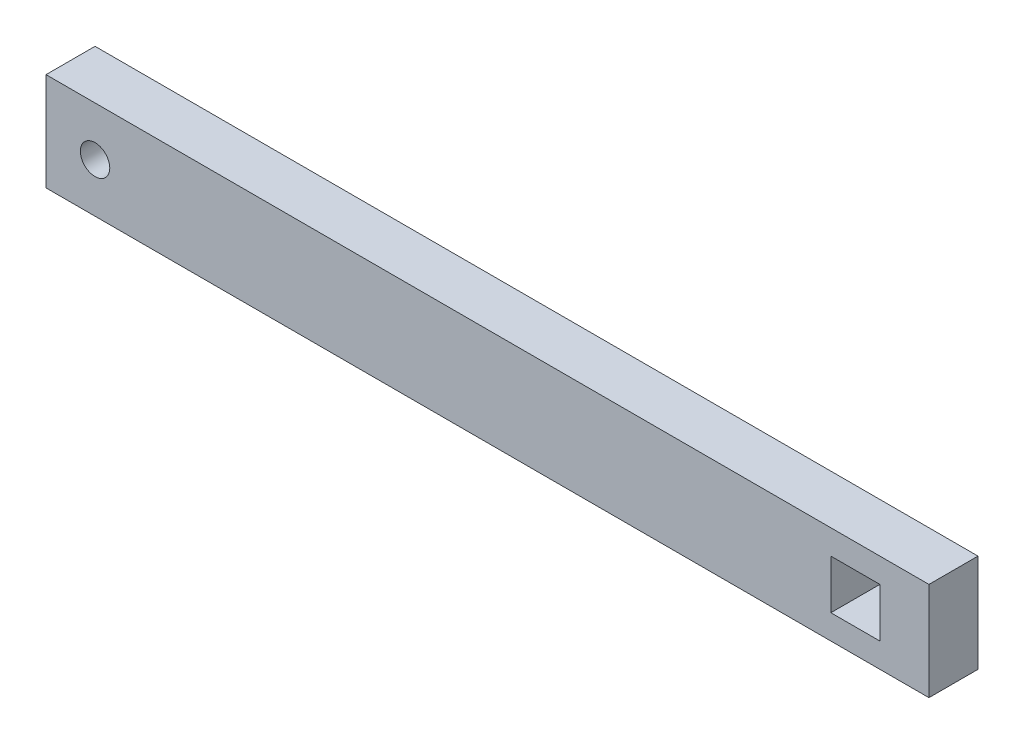
ISO-10303-21;
HEADER;
FILE_DESCRIPTION(('STEP AP214'),'2;1');
FILE_NAME('part.step','',(''),(''),'','','');
FILE_SCHEMA(('AUTOMOTIVE_DESIGN { 1 0 10303 214 1 1 1 1 }'));
ENDSEC;
DATA;
#1=APPLICATION_CONTEXT('core data for automotive mechanical design processes');
#2=APPLICATION_PROTOCOL_DEFINITION('international standard','automotive_design',2000,#1);
#3=PRODUCT_CONTEXT('',#1,'mechanical');
#4=PRODUCT('Part','Part','',(#3));
#5=PRODUCT_RELATED_PRODUCT_CATEGORY('part','',(#4));
#6=PRODUCT_DEFINITION_FORMATION('','',#4);
#7=PRODUCT_DEFINITION_CONTEXT('part definition',#1,'design');
#8=PRODUCT_DEFINITION('design','',#6,#7);
#9=PRODUCT_DEFINITION_SHAPE('','',#8);
#10=(LENGTH_UNIT() NAMED_UNIT(*) SI_UNIT(.MILLI.,.METRE.));
#11=(NAMED_UNIT(*) PLANE_ANGLE_UNIT() SI_UNIT($,.RADIAN.));
#12=(NAMED_UNIT(*) SI_UNIT($,.STERADIAN.) SOLID_ANGLE_UNIT());
#13=UNCERTAINTY_MEASURE_WITH_UNIT(LENGTH_MEASURE(1.E-05),#10,'distance_accuracy_value','');
#14=(GEOMETRIC_REPRESENTATION_CONTEXT(3) GLOBAL_UNCERTAINTY_ASSIGNED_CONTEXT((#13)) GLOBAL_UNIT_ASSIGNED_CONTEXT((#10,
#11,#12)) REPRESENTATION_CONTEXT('',''));
#15=CARTESIAN_POINT('',(0.,0.,0.));
#16=DIRECTION('',(0.,0.,1.));
#17=DIRECTION('',(1.,0.,0.));
#18=AXIS2_PLACEMENT_3D('',#15,#16,#17);
#19=CARTESIAN_POINT('',(0.,0.,5.));
#20=DIRECTION('',(0.,0.,-1.));
#21=DIRECTION('',(-1.,0.,0.));
#22=AXIS2_PLACEMENT_3D('',#19,#20,#21);
#23=PLANE('',#22);
#24=CARTESIAN_POINT('',(5.,5.,5.));
#25=DIRECTION('',(0.,0.,1.));
#26=DIRECTION('',(1.,0.,0.));
#27=AXIS2_PLACEMENT_3D('',#24,#25,#26);
#28=CIRCLE('',#27,1.5);
#29=CARTESIAN_POINT('',(6.5,5.,5.));
#30=VERTEX_POINT('',#29);
#31=EDGE_CURVE('E134',#30,#30,#28,.T.);
#32=ORIENTED_EDGE('',*,*,#31,.F.);
#33=EDGE_LOOP('',(#32));
#34=FACE_BOUND('',#33,.T.);
#35=DIRECTION('',(0.,-1.,0.));
#36=VECTOR('',#35,1.);
#37=CARTESIAN_POINT('',(0.,0.,5.));
#38=LINE('',#37,#36);
#39=CARTESIAN_POINT('',(0.,10.,5.));
#40=VERTEX_POINT('',#39);
#41=CARTESIAN_POINT('',(0.,0.,5.));
#42=VERTEX_POINT('',#41);
#43=EDGE_CURVE('E140',#40,#42,#38,.T.);
#44=ORIENTED_EDGE('',*,*,#43,.T.);
#45=DIRECTION('',(1.,0.,0.));
#46=VECTOR('',#45,1.);
#47=CARTESIAN_POINT('',(0.,0.,5.));
#48=LINE('',#47,#46);
#49=CARTESIAN_POINT('',(90.,0.,5.));
#50=VERTEX_POINT('',#49);
#51=EDGE_CURVE('E143',#42,#50,#48,.T.);
#52=ORIENTED_EDGE('',*,*,#51,.T.);
#53=DIRECTION('',(0.,1.,0.));
#54=VECTOR('',#53,1.);
#55=CARTESIAN_POINT('',(90.,0.,5.));
#56=LINE('',#55,#54);
#57=CARTESIAN_POINT('',(90.,10.,5.));
#58=VERTEX_POINT('',#57);
#59=EDGE_CURVE('E146',#50,#58,#56,.T.);
#60=ORIENTED_EDGE('',*,*,#59,.T.);
#61=DIRECTION('',(-1.,0.,0.));
#62=VECTOR('',#61,1.);
#63=CARTESIAN_POINT('',(0.,10.,5.));
#64=LINE('',#63,#62);
#65=EDGE_CURVE('E148',#58,#40,#64,.T.);
#66=ORIENTED_EDGE('',*,*,#65,.T.);
#67=EDGE_LOOP('',(#44,#52,#60,#66));
#68=FACE_BOUND('',#67,.T.);
#69=DIRECTION('',(0.,1.,0.));
#70=VECTOR('',#69,1.);
#71=CARTESIAN_POINT('',(85.,7.5,5.));
#72=LINE('',#71,#70);
#73=CARTESIAN_POINT('',(85.,2.5,5.));
#74=VERTEX_POINT('',#73);
#75=CARTESIAN_POINT('',(85.,7.5,5.));
#76=VERTEX_POINT('',#75);
#77=EDGE_CURVE('E98',#74,#76,#72,.T.);
#78=ORIENTED_EDGE('',*,*,#77,.F.);
#79=DIRECTION('',(1.,0.,0.));
#80=VECTOR('',#79,1.);
#81=CARTESIAN_POINT('',(85.,2.5,5.));
#82=LINE('',#81,#80);
#83=CARTESIAN_POINT('',(80.,2.5,5.));
#84=VERTEX_POINT('',#83);
#85=EDGE_CURVE('E120',#84,#74,#82,.T.);
#86=ORIENTED_EDGE('',*,*,#85,.F.);
#87=DIRECTION('',(0.,-1.,0.));
#88=VECTOR('',#87,1.);
#89=CARTESIAN_POINT('',(80.,7.5,5.));
#90=LINE('',#89,#88);
#91=CARTESIAN_POINT('',(80.,7.5,5.));
#92=VERTEX_POINT('',#91);
#93=EDGE_CURVE('E118',#92,#84,#90,.T.);
#94=ORIENTED_EDGE('',*,*,#93,.F.);
#95=DIRECTION('',(-1.,0.,0.));
#96=VECTOR('',#95,1.);
#97=CARTESIAN_POINT('',(85.,7.5,5.));
#98=LINE('',#97,#96);
#99=EDGE_CURVE('E106',#76,#92,#98,.T.);
#100=ORIENTED_EDGE('',*,*,#99,.F.);
#101=EDGE_LOOP('',(#78,#86,#94,#100));
#102=FACE_BOUND('',#101,.T.);
#103=ADVANCED_FACE('F33',(#34,#68,#102),#23,.F.);
#104=CARTESIAN_POINT('',(0.,0.,0.));
#105=DIRECTION('',(0.,0.,-1.));
#106=DIRECTION('',(-1.,0.,0.));
#107=AXIS2_PLACEMENT_3D('',#104,#105,#106);
#108=PLANE('',#107);
#109=CARTESIAN_POINT('',(5.,5.,0.));
#110=DIRECTION('',(0.,0.,1.));
#111=DIRECTION('',(1.,0.,0.));
#112=AXIS2_PLACEMENT_3D('',#109,#110,#111);
#113=CIRCLE('',#112,1.5);
#114=CARTESIAN_POINT('',(6.5,5.,0.));
#115=VERTEX_POINT('',#114);
#116=EDGE_CURVE('E114',#115,#115,#113,.T.);
#117=ORIENTED_EDGE('',*,*,#116,.T.);
#118=EDGE_LOOP('',(#117));
#119=FACE_BOUND('',#118,.T.);
#120=DIRECTION('',(0.,-1.,0.));
#121=VECTOR('',#120,1.);
#122=CARTESIAN_POINT('',(0.,0.,0.));
#123=LINE('',#122,#121);
#124=CARTESIAN_POINT('',(0.,10.,0.));
#125=VERTEX_POINT('',#124);
#126=CARTESIAN_POINT('',(0.,0.,0.));
#127=VERTEX_POINT('',#126);
#128=EDGE_CURVE('E137',#125,#127,#123,.T.);
#129=ORIENTED_EDGE('',*,*,#128,.F.);
#130=DIRECTION('',(-1.,0.,0.));
#131=VECTOR('',#130,1.);
#132=CARTESIAN_POINT('',(0.,10.,0.));
#133=LINE('',#132,#131);
#134=CARTESIAN_POINT('',(90.,10.,0.));
#135=VERTEX_POINT('',#134);
#136=EDGE_CURVE('E144',#135,#125,#133,.T.);
#137=ORIENTED_EDGE('',*,*,#136,.F.);
#138=DIRECTION('',(0.,1.,0.));
#139=VECTOR('',#138,1.);
#140=CARTESIAN_POINT('',(90.,0.,0.));
#141=LINE('',#140,#139);
#142=CARTESIAN_POINT('',(90.,0.,0.));
#143=VERTEX_POINT('',#142);
#144=EDGE_CURVE('E155',#143,#135,#141,.T.);
#145=ORIENTED_EDGE('',*,*,#144,.F.);
#146=DIRECTION('',(1.,0.,0.));
#147=VECTOR('',#146,1.);
#148=CARTESIAN_POINT('',(0.,0.,0.));
#149=LINE('',#148,#147);
#150=EDGE_CURVE('E153',#127,#143,#149,.T.);
#151=ORIENTED_EDGE('',*,*,#150,.F.);
#152=EDGE_LOOP('',(#129,#137,#145,#151));
#153=FACE_BOUND('',#152,.T.);
#154=DIRECTION('',(1.,0.,0.));
#155=VECTOR('',#154,1.);
#156=CARTESIAN_POINT('',(85.,2.5,0.));
#157=LINE('',#156,#155);
#158=CARTESIAN_POINT('',(80.,2.5,0.));
#159=VERTEX_POINT('',#158);
#160=CARTESIAN_POINT('',(85.,2.5,0.));
#161=VERTEX_POINT('',#160);
#162=EDGE_CURVE('E107',#159,#161,#157,.T.);
#163=ORIENTED_EDGE('',*,*,#162,.T.);
#164=DIRECTION('',(0.,1.,0.));
#165=VECTOR('',#164,1.);
#166=CARTESIAN_POINT('',(85.,7.5,0.));
#167=LINE('',#166,#165);
#168=CARTESIAN_POINT('',(85.,7.5,0.));
#169=VERTEX_POINT('',#168);
#170=EDGE_CURVE('E56',#161,#169,#167,.T.);
#171=ORIENTED_EDGE('',*,*,#170,.T.);
#172=DIRECTION('',(-1.,0.,0.));
#173=VECTOR('',#172,1.);
#174=CARTESIAN_POINT('',(85.,7.5,0.));
#175=LINE('',#174,#173);
#176=CARTESIAN_POINT('',(80.,7.5,0.));
#177=VERTEX_POINT('',#176);
#178=EDGE_CURVE('E113',#169,#177,#175,.T.);
#179=ORIENTED_EDGE('',*,*,#178,.T.);
#180=DIRECTION('',(0.,-1.,0.));
#181=VECTOR('',#180,1.);
#182=CARTESIAN_POINT('',(80.,7.5,0.));
#183=LINE('',#182,#181);
#184=EDGE_CURVE('E126',#177,#159,#183,.T.);
#185=ORIENTED_EDGE('',*,*,#184,.T.);
#186=EDGE_LOOP('',(#163,#171,#179,#185));
#187=FACE_BOUND('',#186,.T.);
#188=ADVANCED_FACE('F173',(#119,#153,#187),#108,.T.);
#189=CARTESIAN_POINT('',(0.,0.,5.));
#190=DIRECTION('',(1.,0.,0.));
#191=DIRECTION('',(0.,0.,-1.));
#192=AXIS2_PLACEMENT_3D('',#189,#190,#191);
#193=PLANE('',#192);
#194=ORIENTED_EDGE('',*,*,#128,.T.);
#195=DIRECTION('',(0.,0.,-1.));
#196=VECTOR('',#195,1.);
#197=CARTESIAN_POINT('',(0.,0.,5.));
#198=LINE('',#197,#196);
#199=EDGE_CURVE('E11',#42,#127,#198,.T.);
#200=ORIENTED_EDGE('',*,*,#199,.F.);
#201=ORIENTED_EDGE('',*,*,#43,.F.);
#202=DIRECTION('',(0.,0.,-1.));
#203=VECTOR('',#202,1.);
#204=CARTESIAN_POINT('',(0.,10.,5.));
#205=LINE('',#204,#203);
#206=EDGE_CURVE('E150',#40,#125,#205,.T.);
#207=ORIENTED_EDGE('',*,*,#206,.T.);
#208=EDGE_LOOP('',(#194,#200,#201,#207));
#209=FACE_BOUND('',#208,.T.);
#210=ADVANCED_FACE('F35',(#209),#193,.F.);
#211=CARTESIAN_POINT('',(0.,0.,5.));
#212=DIRECTION('',(0.,1.,0.));
#213=DIRECTION('',(0.,0.,1.));
#214=AXIS2_PLACEMENT_3D('',#211,#212,#213);
#215=PLANE('',#214);
#216=ORIENTED_EDGE('',*,*,#150,.T.);
#217=DIRECTION('',(0.,0.,-1.));
#218=VECTOR('',#217,1.);
#219=CARTESIAN_POINT('',(90.,0.,5.));
#220=LINE('',#219,#218);
#221=EDGE_CURVE('E41',#50,#143,#220,.T.);
#222=ORIENTED_EDGE('',*,*,#221,.F.);
#223=ORIENTED_EDGE('',*,*,#51,.F.);
#224=ORIENTED_EDGE('',*,*,#199,.T.);
#225=EDGE_LOOP('',(#216,#222,#223,#224));
#226=FACE_BOUND('',#225,.T.);
#227=ADVANCED_FACE('F183',(#226),#215,.F.);
#228=CARTESIAN_POINT('',(90.,0.,5.));
#229=DIRECTION('',(-1.,0.,0.));
#230=DIRECTION('',(0.,0.,1.));
#231=AXIS2_PLACEMENT_3D('',#228,#229,#230);
#232=PLANE('',#231);
#233=ORIENTED_EDGE('',*,*,#144,.T.);
#234=DIRECTION('',(0.,0.,-1.));
#235=VECTOR('',#234,1.);
#236=CARTESIAN_POINT('',(90.,10.,5.));
#237=LINE('',#236,#235);
#238=EDGE_CURVE('E160',#58,#135,#237,.T.);
#239=ORIENTED_EDGE('',*,*,#238,.F.);
#240=ORIENTED_EDGE('',*,*,#59,.F.);
#241=ORIENTED_EDGE('',*,*,#221,.T.);
#242=EDGE_LOOP('',(#233,#239,#240,#241));
#243=FACE_BOUND('',#242,.T.);
#244=ADVANCED_FACE('F167',(#243),#232,.F.);
#245=CARTESIAN_POINT('',(0.,10.,5.));
#246=DIRECTION('',(0.,-1.,0.));
#247=DIRECTION('',(0.,0.,-1.));
#248=AXIS2_PLACEMENT_3D('',#245,#246,#247);
#249=PLANE('',#248);
#250=ORIENTED_EDGE('',*,*,#136,.T.);
#251=ORIENTED_EDGE('',*,*,#206,.F.);
#252=ORIENTED_EDGE('',*,*,#65,.F.);
#253=ORIENTED_EDGE('',*,*,#238,.T.);
#254=EDGE_LOOP('',(#250,#251,#252,#253));
#255=FACE_BOUND('',#254,.T.);
#256=ADVANCED_FACE('F177',(#255),#249,.F.);
#257=CARTESIAN_POINT('',(5.,5.,5.));
#258=DIRECTION('',(0.,0.,-1.));
#259=DIRECTION('',(-1.,0.,0.));
#260=AXIS2_PLACEMENT_3D('',#257,#258,#259);
#261=CYLINDRICAL_SURFACE('',#260,1.5);
#262=ORIENTED_EDGE('',*,*,#31,.T.);
#263=EDGE_LOOP('',(#262));
#264=FACE_BOUND('',#263,.T.);
#265=ORIENTED_EDGE('',*,*,#116,.F.);
#266=EDGE_LOOP('',(#265));
#267=FACE_BOUND('',#266,.T.);
#268=ADVANCED_FACE('F200',(#264,#267),#261,.F.);
#269=CARTESIAN_POINT('',(85.,7.5,5.));
#270=DIRECTION('',(-1.,0.,0.));
#271=DIRECTION('',(0.,0.,1.));
#272=AXIS2_PLACEMENT_3D('',#269,#270,#271);
#273=PLANE('',#272);
#274=ORIENTED_EDGE('',*,*,#170,.F.);
#275=DIRECTION('',(0.,0.,-1.));
#276=VECTOR('',#275,1.);
#277=CARTESIAN_POINT('',(85.,2.5,5.));
#278=LINE('',#277,#276);
#279=EDGE_CURVE('E102',#74,#161,#278,.T.);
#280=ORIENTED_EDGE('',*,*,#279,.F.);
#281=ORIENTED_EDGE('',*,*,#77,.T.);
#282=DIRECTION('',(0.,0.,-1.));
#283=VECTOR('',#282,1.);
#284=CARTESIAN_POINT('',(85.,7.5,5.));
#285=LINE('',#284,#283);
#286=EDGE_CURVE('E101',#76,#169,#285,.T.);
#287=ORIENTED_EDGE('',*,*,#286,.T.);
#288=EDGE_LOOP('',(#274,#280,#281,#287));
#289=FACE_BOUND('',#288,.T.);
#290=ADVANCED_FACE('F100',(#289),#273,.T.);
#291=CARTESIAN_POINT('',(85.,7.5,5.));
#292=DIRECTION('',(0.,-1.,0.));
#293=DIRECTION('',(0.,0.,-1.));
#294=AXIS2_PLACEMENT_3D('',#291,#292,#293);
#295=PLANE('',#294);
#296=ORIENTED_EDGE('',*,*,#178,.F.);
#297=ORIENTED_EDGE('',*,*,#286,.F.);
#298=ORIENTED_EDGE('',*,*,#99,.T.);
#299=DIRECTION('',(0.,0.,-1.));
#300=VECTOR('',#299,1.);
#301=CARTESIAN_POINT('',(80.,7.5,5.));
#302=LINE('',#301,#300);
#303=EDGE_CURVE('E115',#92,#177,#302,.T.);
#304=ORIENTED_EDGE('',*,*,#303,.T.);
#305=EDGE_LOOP('',(#296,#297,#298,#304));
#306=FACE_BOUND('',#305,.T.);
#307=ADVANCED_FACE('F110',(#306),#295,.T.);
#308=CARTESIAN_POINT('',(80.,7.5,5.));
#309=DIRECTION('',(1.,0.,0.));
#310=DIRECTION('',(0.,0.,-1.));
#311=AXIS2_PLACEMENT_3D('',#308,#309,#310);
#312=PLANE('',#311);
#313=ORIENTED_EDGE('',*,*,#184,.F.);
#314=ORIENTED_EDGE('',*,*,#303,.F.);
#315=ORIENTED_EDGE('',*,*,#93,.T.);
#316=DIRECTION('',(0.,0.,-1.));
#317=VECTOR('',#316,1.);
#318=CARTESIAN_POINT('',(80.,2.5,5.));
#319=LINE('',#318,#317);
#320=EDGE_CURVE('E48',#84,#159,#319,.T.);
#321=ORIENTED_EDGE('',*,*,#320,.T.);
#322=EDGE_LOOP('',(#313,#314,#315,#321));
#323=FACE_BOUND('',#322,.T.);
#324=ADVANCED_FACE('F216',(#323),#312,.T.);
#325=CARTESIAN_POINT('',(85.,2.5,5.));
#326=DIRECTION('',(0.,1.,0.));
#327=DIRECTION('',(0.,0.,1.));
#328=AXIS2_PLACEMENT_3D('',#325,#326,#327);
#329=PLANE('',#328);
#330=ORIENTED_EDGE('',*,*,#162,.F.);
#331=ORIENTED_EDGE('',*,*,#320,.F.);
#332=ORIENTED_EDGE('',*,*,#85,.T.);
#333=ORIENTED_EDGE('',*,*,#279,.T.);
#334=EDGE_LOOP('',(#330,#331,#332,#333));
#335=FACE_BOUND('',#334,.T.);
#336=ADVANCED_FACE('F221',(#335),#329,.T.);
#337=CLOSED_SHELL('',(#103,#188,#210,#227,#244,#256,#268,#290,#307,#324,#336));
#338=MANIFOLD_SOLID_BREP('B2',#337);
#339=ADVANCED_BREP_SHAPE_REPRESENTATION('',(#18,#338),#14);
#340=SHAPE_DEFINITION_REPRESENTATION(#9,#339);
ENDSEC;
END-ISO-10303-21;
